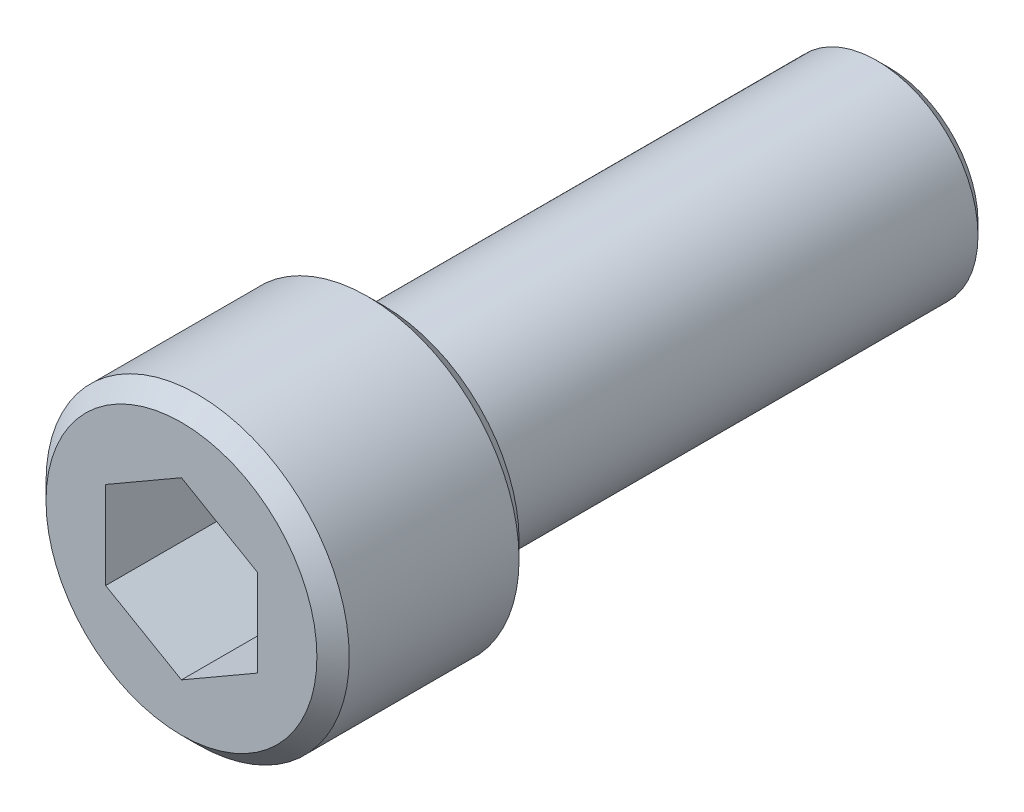
ISO-10303-21;
HEADER;
FILE_DESCRIPTION(('STEP AP214'),'2;1');
FILE_NAME('part.step','',(''),(''),'','','');
FILE_SCHEMA(('AUTOMOTIVE_DESIGN { 1 0 10303 214 1 1 1 1 }'));
ENDSEC;
DATA;
#1=APPLICATION_CONTEXT('core data for automotive mechanical design processes');
#2=APPLICATION_PROTOCOL_DEFINITION('international standard','automotive_design',2000,#1);
#3=PRODUCT_CONTEXT('',#1,'mechanical');
#4=PRODUCT('Part','Part','',(#3));
#5=PRODUCT_RELATED_PRODUCT_CATEGORY('part','',(#4));
#6=PRODUCT_DEFINITION_FORMATION('','',#4);
#7=PRODUCT_DEFINITION_CONTEXT('part definition',#1,'design');
#8=PRODUCT_DEFINITION('design','',#6,#7);
#9=PRODUCT_DEFINITION_SHAPE('','',#8);
#10=(LENGTH_UNIT() NAMED_UNIT(*) SI_UNIT(.MILLI.,.METRE.));
#11=(NAMED_UNIT(*) PLANE_ANGLE_UNIT() SI_UNIT($,.RADIAN.));
#12=(NAMED_UNIT(*) SI_UNIT($,.STERADIAN.) SOLID_ANGLE_UNIT());
#13=UNCERTAINTY_MEASURE_WITH_UNIT(LENGTH_MEASURE(1.E-05),#10,'distance_accuracy_value','');
#14=(GEOMETRIC_REPRESENTATION_CONTEXT(3) GLOBAL_UNCERTAINTY_ASSIGNED_CONTEXT((#13)) GLOBAL_UNIT_ASSIGNED_CONTEXT((#10,
#11,#12)) REPRESENTATION_CONTEXT('',''));
#15=CARTESIAN_POINT('',(0.,0.,0.));
#16=DIRECTION('',(0.,0.,1.));
#17=DIRECTION('',(1.,0.,0.));
#18=AXIS2_PLACEMENT_3D('',#15,#16,#17);
#19=CARTESIAN_POINT('',(0.,-2.74963065701559,2.286));
#20=DIRECTION('',(0.,0.,-1.));
#21=DIRECTION('',(-1.,0.,0.));
#22=AXIS2_PLACEMENT_3D('',#19,#20,#21);
#23=PLANE('',#22);
#24=DIRECTION('',(0.,1.,0.));
#25=VECTOR('',#24,1.);
#26=CARTESIAN_POINT('',(2.38125,1.3748153285078,2.286));
#27=LINE('',#26,#25);
#28=CARTESIAN_POINT('',(2.38125,-1.3748153285078,2.286));
#29=VERTEX_POINT('',#28);
#30=CARTESIAN_POINT('',(2.38125,1.3748153285078,2.286));
#31=VERTEX_POINT('',#30);
#32=EDGE_CURVE('E127',#29,#31,#27,.T.);
#33=ORIENTED_EDGE('',*,*,#32,.T.);
#34=DIRECTION('',(-0.866025403784439,0.5,0.));
#35=VECTOR('',#34,1.);
#36=CARTESIAN_POINT('',(0.,2.74963065701559,2.286));
#37=LINE('',#36,#35);
#38=CARTESIAN_POINT('',(0.,2.74963065701559,2.286));
#39=VERTEX_POINT('',#38);
#40=EDGE_CURVE('E132',#31,#39,#37,.T.);
#41=ORIENTED_EDGE('',*,*,#40,.T.);
#42=DIRECTION('',(-0.866025403784438,-0.500000000000001,0.));
#43=VECTOR('',#42,1.);
#44=CARTESIAN_POINT('',(-2.38125,1.3748153285078,2.286));
#45=LINE('',#44,#43);
#46=CARTESIAN_POINT('',(-2.38125,1.3748153285078,2.286));
#47=VERTEX_POINT('',#46);
#48=EDGE_CURVE('E136',#39,#47,#45,.T.);
#49=ORIENTED_EDGE('',*,*,#48,.T.);
#50=DIRECTION('',(0.,-1.,0.));
#51=VECTOR('',#50,1.);
#52=CARTESIAN_POINT('',(-2.38125,-1.3748153285078,2.286));
#53=LINE('',#52,#51);
#54=CARTESIAN_POINT('',(-2.38125,-1.3748153285078,2.286));
#55=VERTEX_POINT('',#54);
#56=EDGE_CURVE('E68',#47,#55,#53,.T.);
#57=ORIENTED_EDGE('',*,*,#56,.T.);
#58=DIRECTION('',(0.866025403784439,-0.5,0.));
#59=VECTOR('',#58,1.);
#60=CARTESIAN_POINT('',(0.,-2.74963065701559,2.286));
#61=LINE('',#60,#59);
#62=CARTESIAN_POINT('',(0.,-2.74963065701559,2.286));
#63=VERTEX_POINT('',#62);
#64=EDGE_CURVE('E70',#55,#63,#61,.T.);
#65=ORIENTED_EDGE('',*,*,#64,.T.);
#66=DIRECTION('',(0.866025403784439,0.5,0.));
#67=VECTOR('',#66,1.);
#68=CARTESIAN_POINT('',(2.38125,-1.3748153285078,2.286));
#69=LINE('',#68,#67);
#70=EDGE_CURVE('E72',#63,#29,#69,.T.);
#71=ORIENTED_EDGE('',*,*,#70,.T.);
#72=EDGE_LOOP('',(#33,#41,#49,#57,#65,#71));
#73=FACE_BOUND('',#72,.T.);
#74=ADVANCED_FACE('F17',(#73),#23,.F.);
#75=CARTESIAN_POINT('',(2.38125,-1.3748153285078,2.286));
#76=DIRECTION('',(0.5,-0.866025403784439,0.));
#77=DIRECTION('',(0.866025403784439,0.5,0.));
#78=AXIS2_PLACEMENT_3D('',#75,#76,#77);
#79=PLANE('',#78);
#80=DIRECTION('',(0.,0.,1.));
#81=VECTOR('',#80,1.);
#82=CARTESIAN_POINT('',(2.38125,-1.3748153285078,2.286));
#83=LINE('',#82,#81);
#84=CARTESIAN_POINT('',(2.38125,-1.3748153285078,6.35));
#85=VERTEX_POINT('',#84);
#86=EDGE_CURVE('E83',#85,#29,#83,.F.);
#87=ORIENTED_EDGE('',*,*,#86,.T.);
#88=ORIENTED_EDGE('',*,*,#70,.F.);
#89=DIRECTION('',(0.,0.,1.));
#90=VECTOR('',#89,1.);
#91=CARTESIAN_POINT('',(0.,-2.74963065701559,2.286));
#92=LINE('',#91,#90);
#93=CARTESIAN_POINT('',(0.,-2.74963065701559,6.35));
#94=VERTEX_POINT('',#93);
#95=EDGE_CURVE('E77',#63,#94,#92,.T.);
#96=ORIENTED_EDGE('',*,*,#95,.T.);
#97=DIRECTION('',(-0.866025403784439,-0.5,0.));
#98=VECTOR('',#97,1.);
#99=CARTESIAN_POINT('',(2.38125,-1.3748153285078,6.35));
#100=LINE('',#99,#98);
#101=EDGE_CURVE('E124',#85,#94,#100,.T.);
#102=ORIENTED_EDGE('',*,*,#101,.F.);
#103=EDGE_LOOP('',(#87,#88,#96,#102));
#104=FACE_BOUND('',#103,.T.);
#105=ADVANCED_FACE('F80',(#104),#79,.F.);
#106=CARTESIAN_POINT('',(0.,-2.74963065701559,2.286));
#107=DIRECTION('',(-0.5,-0.866025403784439,0.));
#108=DIRECTION('',(0.866025403784439,-0.5,0.));
#109=AXIS2_PLACEMENT_3D('',#106,#107,#108);
#110=PLANE('',#109);
#111=ORIENTED_EDGE('',*,*,#95,.F.);
#112=ORIENTED_EDGE('',*,*,#64,.F.);
#113=DIRECTION('',(0.,0.,1.));
#114=VECTOR('',#113,1.);
#115=CARTESIAN_POINT('',(-2.38125,-1.3748153285078,2.286));
#116=LINE('',#115,#114);
#117=CARTESIAN_POINT('',(-2.38125,-1.3748153285078,6.35));
#118=VERTEX_POINT('',#117);
#119=EDGE_CURVE('E91',#55,#118,#116,.T.);
#120=ORIENTED_EDGE('',*,*,#119,.T.);
#121=DIRECTION('',(-0.866025403784439,0.5,0.));
#122=VECTOR('',#121,1.);
#123=CARTESIAN_POINT('',(0.,-2.74963065701559,6.35));
#124=LINE('',#123,#122);
#125=EDGE_CURVE('E88',#94,#118,#124,.T.);
#126=ORIENTED_EDGE('',*,*,#125,.F.);
#127=EDGE_LOOP('',(#111,#112,#120,#126));
#128=FACE_BOUND('',#127,.T.);
#129=ADVANCED_FACE('F86',(#128),#110,.F.);
#130=CARTESIAN_POINT('',(-2.38125,-1.3748153285078,2.286));
#131=DIRECTION('',(-1.,0.,0.));
#132=DIRECTION('',(0.,-1.,0.));
#133=AXIS2_PLACEMENT_3D('',#130,#131,#132);
#134=PLANE('',#133);
#135=ORIENTED_EDGE('',*,*,#119,.F.);
#136=ORIENTED_EDGE('',*,*,#56,.F.);
#137=DIRECTION('',(0.,0.,1.));
#138=VECTOR('',#137,1.);
#139=CARTESIAN_POINT('',(-2.38125,1.3748153285078,2.286));
#140=LINE('',#139,#138);
#141=CARTESIAN_POINT('',(-2.38125,1.3748153285078,6.35));
#142=VERTEX_POINT('',#141);
#143=EDGE_CURVE('E134',#47,#142,#140,.T.);
#144=ORIENTED_EDGE('',*,*,#143,.T.);
#145=DIRECTION('',(0.,1.,0.));
#146=VECTOR('',#145,1.);
#147=CARTESIAN_POINT('',(-2.38125,0.,6.35));
#148=LINE('',#147,#146);
#149=EDGE_CURVE('E120',#118,#142,#148,.T.);
#150=ORIENTED_EDGE('',*,*,#149,.F.);
#151=EDGE_LOOP('',(#135,#136,#144,#150));
#152=FACE_BOUND('',#151,.T.);
#153=ADVANCED_FACE('F139',(#152),#134,.F.);
#154=CARTESIAN_POINT('',(-2.38125,1.3748153285078,2.286));
#155=DIRECTION('',(-0.500000000000001,0.866025403784438,0.));
#156=DIRECTION('',(-0.866025403784438,-0.500000000000001,0.));
#157=AXIS2_PLACEMENT_3D('',#154,#155,#156);
#158=PLANE('',#157);
#159=ORIENTED_EDGE('',*,*,#143,.F.);
#160=ORIENTED_EDGE('',*,*,#48,.F.);
#161=DIRECTION('',(0.,0.,1.));
#162=VECTOR('',#161,1.);
#163=CARTESIAN_POINT('',(0.,2.74963065701559,2.286));
#164=LINE('',#163,#162);
#165=CARTESIAN_POINT('',(0.,2.74963065701559,6.35));
#166=VERTEX_POINT('',#165);
#167=EDGE_CURVE('E130',#39,#166,#164,.T.);
#168=ORIENTED_EDGE('',*,*,#167,.T.);
#169=DIRECTION('',(0.866025403784438,0.5,0.));
#170=VECTOR('',#169,1.);
#171=CARTESIAN_POINT('',(-2.38125,1.3748153285078,6.35));
#172=LINE('',#171,#170);
#173=EDGE_CURVE('E117',#142,#166,#172,.T.);
#174=ORIENTED_EDGE('',*,*,#173,.F.);
#175=EDGE_LOOP('',(#159,#160,#168,#174));
#176=FACE_BOUND('',#175,.T.);
#177=ADVANCED_FACE('F151',(#176),#158,.F.);
#178=CARTESIAN_POINT('',(0.,2.74963065701559,2.286));
#179=DIRECTION('',(0.5,0.866025403784439,0.));
#180=DIRECTION('',(-0.866025403784439,0.5,0.));
#181=AXIS2_PLACEMENT_3D('',#178,#179,#180);
#182=PLANE('',#181);
#183=ORIENTED_EDGE('',*,*,#167,.F.);
#184=ORIENTED_EDGE('',*,*,#40,.F.);
#185=DIRECTION('',(0.,0.,1.));
#186=VECTOR('',#185,1.);
#187=CARTESIAN_POINT('',(2.38125,1.3748153285078,2.286));
#188=LINE('',#187,#186);
#189=CARTESIAN_POINT('',(2.38125,1.3748153285078,6.35));
#190=VERTEX_POINT('',#189);
#191=EDGE_CURVE('E35',#31,#190,#188,.T.);
#192=ORIENTED_EDGE('',*,*,#191,.T.);
#193=DIRECTION('',(0.866025403784439,-0.5,0.));
#194=VECTOR('',#193,1.);
#195=CARTESIAN_POINT('',(0.,2.74963065701559,6.35));
#196=LINE('',#195,#194);
#197=EDGE_CURVE('E114',#166,#190,#196,.T.);
#198=ORIENTED_EDGE('',*,*,#197,.F.);
#199=EDGE_LOOP('',(#183,#184,#192,#198));
#200=FACE_BOUND('',#199,.T.);
#201=ADVANCED_FACE('F149',(#200),#182,.F.);
#202=CARTESIAN_POINT('',(2.38125,1.3748153285078,2.286));
#203=DIRECTION('',(1.,0.,0.));
#204=DIRECTION('',(0.,1.,0.));
#205=AXIS2_PLACEMENT_3D('',#202,#203,#204);
#206=PLANE('',#205);
#207=ORIENTED_EDGE('',*,*,#191,.F.);
#208=ORIENTED_EDGE('',*,*,#32,.F.);
#209=ORIENTED_EDGE('',*,*,#86,.F.);
#210=DIRECTION('',(0.,1.,0.));
#211=VECTOR('',#210,1.);
#212=CARTESIAN_POINT('',(2.38125,0.,6.35));
#213=LINE('',#212,#211);
#214=EDGE_CURVE('E111',#190,#85,#213,.F.);
#215=ORIENTED_EDGE('',*,*,#214,.F.);
#216=EDGE_LOOP('',(#207,#208,#209,#215));
#217=FACE_BOUND('',#216,.T.);
#218=ADVANCED_FACE('F146',(#217),#206,.F.);
#219=CARTESIAN_POINT('',(0.,0.,6.35));
#220=DIRECTION('',(0.,0.,1.));
#221=DIRECTION('',(1.,0.,0.));
#222=AXIS2_PLACEMENT_3D('',#219,#220,#221);
#223=PLANE('',#222);
#224=ORIENTED_EDGE('',*,*,#197,.T.);
#225=ORIENTED_EDGE('',*,*,#214,.T.);
#226=ORIENTED_EDGE('',*,*,#101,.T.);
#227=ORIENTED_EDGE('',*,*,#125,.T.);
#228=ORIENTED_EDGE('',*,*,#149,.T.);
#229=ORIENTED_EDGE('',*,*,#173,.T.);
#230=EDGE_LOOP('',(#224,#225,#226,#227,#228,#229));
#231=FACE_BOUND('',#230,.T.);
#232=CARTESIAN_POINT('',(0.,0.,6.34999999999764));
#233=DIRECTION('',(0.,0.,-1.));
#234=DIRECTION('',(-1.,0.,0.));
#235=AXIS2_PLACEMENT_3D('',#232,#233,#234);
#236=CIRCLE('',#235,4.25449999994498);
#237=CARTESIAN_POINT('',(-4.25449999994498,0.,6.34999999999764));
#238=VERTEX_POINT('',#237);
#239=EDGE_CURVE('E20',#238,#238,#236,.T.);
#240=ORIENTED_EDGE('',*,*,#239,.F.);
#241=EDGE_LOOP('',(#240));
#242=FACE_BOUND('',#241,.T.);
#243=ADVANCED_FACE('F143',(#231,#242),#223,.T.);
#244=CARTESIAN_POINT('',(0.,0.,5.84200000002966));
#245=DIRECTION('',(0.,0.,-1.));
#246=DIRECTION('',(-1.,0.,0.));
#247=AXIS2_PLACEMENT_3D('',#244,#245,#246);
#248=CONICAL_SURFACE('',#247,4.7624999999698,0.785398163453397);
#249=ORIENTED_EDGE('',*,*,#239,.T.);
#250=EDGE_LOOP('',(#249));
#251=FACE_BOUND('',#250,.T.);
#252=CARTESIAN_POINT('',(0.,0.,5.84200000000001));
#253=DIRECTION('',(0.,0.,-1.));
#254=DIRECTION('',(-1.,0.,0.));
#255=AXIS2_PLACEMENT_3D('',#252,#253,#254);
#256=CIRCLE('',#255,4.7625);
#257=CARTESIAN_POINT('',(-4.7625,0.,5.84200000000001));
#258=VERTEX_POINT('',#257);
#259=EDGE_CURVE('E103',#258,#258,#256,.T.);
#260=ORIENTED_EDGE('',*,*,#259,.F.);
#261=EDGE_LOOP('',(#260));
#262=FACE_BOUND('',#261,.T.);
#263=ADVANCED_FACE('F188',(#251,#262),#248,.T.);
#264=CARTESIAN_POINT('',(0.,0.,6.35));
#265=DIRECTION('',(0.,0.,-1.));
#266=DIRECTION('',(-1.,0.,0.));
#267=AXIS2_PLACEMENT_3D('',#264,#265,#266);
#268=CYLINDRICAL_SURFACE('',#267,4.7625);
#269=ORIENTED_EDGE('',*,*,#259,.T.);
#270=EDGE_LOOP('',(#269));
#271=FACE_BOUND('',#270,.T.);
#272=CARTESIAN_POINT('',(0.,0.,0.507999999967979));
#273=DIRECTION('',(0.,0.,1.));
#274=DIRECTION('',(1.,0.,0.));
#275=AXIS2_PLACEMENT_3D('',#272,#273,#274);
#276=CIRCLE('',#275,4.76250000002665);
#277=CARTESIAN_POINT('',(4.76250000002665,0.,0.507999999967979));
#278=VERTEX_POINT('',#277);
#279=EDGE_CURVE('E99',#278,#278,#276,.F.);
#280=ORIENTED_EDGE('',*,*,#279,.F.);
#281=EDGE_LOOP('',(#280));
#282=FACE_BOUND('',#281,.T.);
#283=ADVANCED_FACE('F184',(#271,#282),#268,.T.);
#284=CARTESIAN_POINT('',(0.,0.,-15.875));
#285=DIRECTION('',(0.,0.,1.));
#286=DIRECTION('',(1.,0.,0.));
#287=AXIS2_PLACEMENT_3D('',#284,#285,#286);
#288=PLANE('',#287);
#289=CARTESIAN_POINT('',(0.,0.,-15.8749999999372));
#290=DIRECTION('',(0.,0.,1.));
#291=DIRECTION('',(1.,0.,0.));
#292=AXIS2_PLACEMENT_3D('',#289,#290,#291);
#293=CIRCLE('',#292,2.79399999999441);
#294=CARTESIAN_POINT('',(2.79399999999441,0.,-15.8749999999372));
#295=VERTEX_POINT('',#294);
#296=EDGE_CURVE('E97',#295,#295,#293,.T.);
#297=ORIENTED_EDGE('',*,*,#296,.F.);
#298=EDGE_LOOP('',(#297));
#299=FACE_BOUND('',#298,.T.);
#300=ADVANCED_FACE('F180',(#299),#288,.F.);
#301=CARTESIAN_POINT('',(0.,0.,0.507999999911135));
#302=DIRECTION('',(0.,0.,1.));
#303=DIRECTION('',(1.,0.,0.));
#304=AXIS2_PLACEMENT_3D('',#301,#302,#303);
#305=CONICAL_SURFACE('',#304,4.76249999991296,0.785398163397448);
#306=CARTESIAN_POINT('',(0.,0.,0.));
#307=DIRECTION('',(0.,0.,1.));
#308=DIRECTION('',(1.,0.,0.));
#309=AXIS2_PLACEMENT_3D('',#306,#307,#308);
#310=CIRCLE('',#309,4.25450000000183);
#311=CARTESIAN_POINT('',(4.25450000000183,0.,0.));
#312=VERTEX_POINT('',#311);
#313=EDGE_CURVE('E95',#312,#312,#310,.T.);
#314=ORIENTED_EDGE('',*,*,#313,.T.);
#315=EDGE_LOOP('',(#314));
#316=FACE_BOUND('',#315,.T.);
#317=ORIENTED_EDGE('',*,*,#279,.T.);
#318=EDGE_LOOP('',(#317));
#319=FACE_BOUND('',#318,.T.);
#320=ADVANCED_FACE('F176',(#316,#319),#305,.T.);
#321=CARTESIAN_POINT('',(0.,0.,-15.4939999999897));
#322=DIRECTION('',(0.,0.,1.));
#323=DIRECTION('',(1.,0.,0.));
#324=AXIS2_PLACEMENT_3D('',#321,#322,#323);
#325=CONICAL_SURFACE('',#324,3.17499999999882,0.785398163472046);
#326=CARTESIAN_POINT('',(0.,0.,-15.494));
#327=DIRECTION('',(0.,0.,1.));
#328=DIRECTION('',(1.,0.,0.));
#329=AXIS2_PLACEMENT_3D('',#326,#327,#328);
#330=CIRCLE('',#329,3.175);
#331=CARTESIAN_POINT('',(3.175,0.,-15.494));
#332=VERTEX_POINT('',#331);
#333=EDGE_CURVE('E26',#332,#332,#330,.T.);
#334=ORIENTED_EDGE('',*,*,#333,.F.);
#335=EDGE_LOOP('',(#334));
#336=FACE_BOUND('',#335,.T.);
#337=ORIENTED_EDGE('',*,*,#296,.T.);
#338=EDGE_LOOP('',(#337));
#339=FACE_BOUND('',#338,.T.);
#340=ADVANCED_FACE('F169',(#336,#339),#325,.T.);
#341=CARTESIAN_POINT('',(0.,0.,0.));
#342=DIRECTION('',(0.,0.,1.));
#343=DIRECTION('',(1.,0.,0.));
#344=AXIS2_PLACEMENT_3D('',#341,#342,#343);
#345=PLANE('',#344);
#346=CARTESIAN_POINT('',(0.,0.,0.));
#347=DIRECTION('',(0.,0.,1.));
#348=DIRECTION('',(1.,0.,0.));
#349=AXIS2_PLACEMENT_3D('',#346,#347,#348);
#350=CIRCLE('',#349,3.175);
#351=CARTESIAN_POINT('',(3.175,0.,0.));
#352=VERTEX_POINT('',#351);
#353=EDGE_CURVE('E11',#352,#352,#350,.F.);
#354=ORIENTED_EDGE('',*,*,#353,.F.);
#355=EDGE_LOOP('',(#354));
#356=FACE_BOUND('',#355,.T.);
#357=ORIENTED_EDGE('',*,*,#313,.F.);
#358=EDGE_LOOP('',(#357));
#359=FACE_BOUND('',#358,.T.);
#360=ADVANCED_FACE('F163',(#356,#359),#345,.F.);
#361=CARTESIAN_POINT('',(0.,0.,-15.875));
#362=DIRECTION('',(0.,0.,1.));
#363=DIRECTION('',(1.,0.,0.));
#364=AXIS2_PLACEMENT_3D('',#361,#362,#363);
#365=CYLINDRICAL_SURFACE('',#364,3.175);
#366=ORIENTED_EDGE('',*,*,#353,.T.);
#367=EDGE_LOOP('',(#366));
#368=FACE_BOUND('',#367,.T.);
#369=ORIENTED_EDGE('',*,*,#333,.T.);
#370=EDGE_LOOP('',(#369));
#371=FACE_BOUND('',#370,.T.);
#372=ADVANCED_FACE('F161',(#368,#371),#365,.T.);
#373=CLOSED_SHELL('',(#74,#105,#129,#153,#177,#201,#218,#243,#263,#283,#300,#320,#340,#360,#372));
#374=MANIFOLD_SOLID_BREP('B1',#373);
#375=ADVANCED_BREP_SHAPE_REPRESENTATION('',(#18,#374),#14);
#376=SHAPE_DEFINITION_REPRESENTATION(#9,#375);
ENDSEC;
END-ISO-10303-21;
